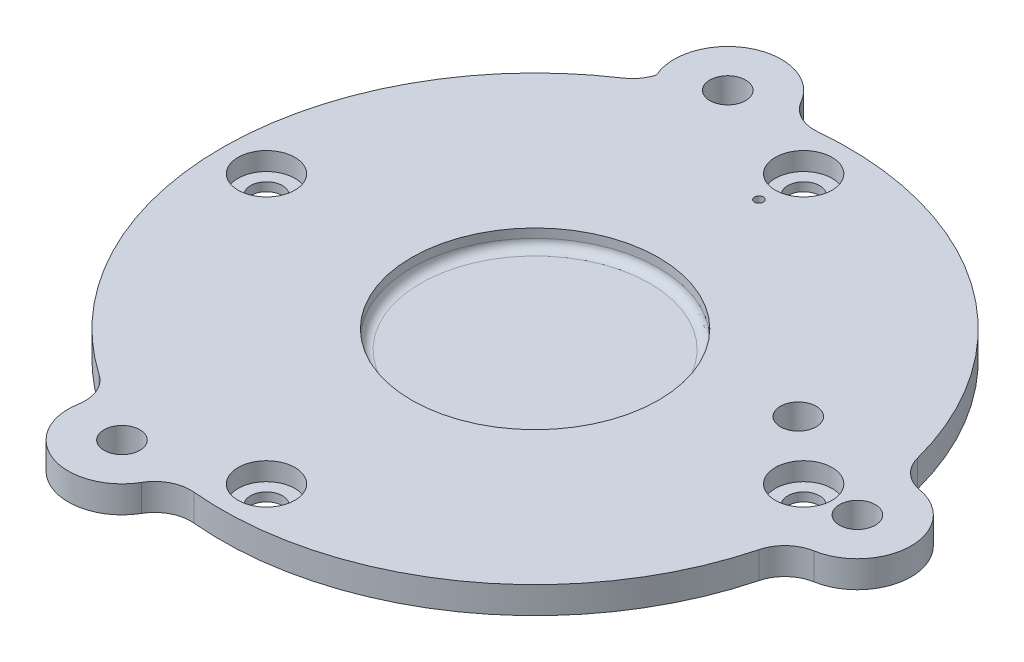
ISO-10303-21;
HEADER;
FILE_DESCRIPTION(('STEP AP214'),'2;1');
FILE_NAME('part.step','',(''),(''),'','','');
FILE_SCHEMA(('AUTOMOTIVE_DESIGN { 1 0 10303 214 1 1 1 1 }'));
ENDSEC;
DATA;
#1=APPLICATION_CONTEXT('core data for automotive mechanical design processes');
#2=APPLICATION_PROTOCOL_DEFINITION('international standard','automotive_design',2000,#1);
#3=PRODUCT_CONTEXT('',#1,'mechanical');
#4=PRODUCT('Part','Part','',(#3));
#5=PRODUCT_RELATED_PRODUCT_CATEGORY('part','',(#4));
#6=PRODUCT_DEFINITION_FORMATION('','',#4);
#7=PRODUCT_DEFINITION_CONTEXT('part definition',#1,'design');
#8=PRODUCT_DEFINITION('design','',#6,#7);
#9=PRODUCT_DEFINITION_SHAPE('','',#8);
#10=(LENGTH_UNIT() NAMED_UNIT(*) SI_UNIT(.MILLI.,.METRE.));
#11=(NAMED_UNIT(*) PLANE_ANGLE_UNIT() SI_UNIT($,.RADIAN.));
#12=(NAMED_UNIT(*) SI_UNIT($,.STERADIAN.) SOLID_ANGLE_UNIT());
#13=UNCERTAINTY_MEASURE_WITH_UNIT(LENGTH_MEASURE(1.E-05),#10,'distance_accuracy_value','');
#14=(GEOMETRIC_REPRESENTATION_CONTEXT(3) GLOBAL_UNCERTAINTY_ASSIGNED_CONTEXT((#13)) GLOBAL_UNIT_ASSIGNED_CONTEXT((#10,
#11,#12)) REPRESENTATION_CONTEXT('',''));
#15=CARTESIAN_POINT('',(0.,0.,0.));
#16=DIRECTION('',(0.,0.,1.));
#17=DIRECTION('',(1.,0.,0.));
#18=AXIS2_PLACEMENT_3D('',#15,#16,#17);
#19=CARTESIAN_POINT('',(0.,1.5,0.));
#20=DIRECTION('',(0.,-1.,0.));
#21=DIRECTION('',(0.,0.,-1.));
#22=AXIS2_PLACEMENT_3D('',#19,#20,#21);
#23=CYLINDRICAL_SURFACE('',#22,17.5);
#24=CARTESIAN_POINT('',(0.,0.,0.));
#25=DIRECTION('',(0.,1.,0.));
#26=DIRECTION('',(0.,0.,1.));
#27=AXIS2_PLACEMENT_3D('',#24,#25,#26);
#28=CIRCLE('',#27,17.5);
#29=CARTESIAN_POINT('',(-9.69466748680568,0.,-14.5692629298902));
#30=VERTEX_POINT('',#29);
#31=CARTESIAN_POINT('',(-9.94392059443859,0.,14.4002931640818));
#32=VERTEX_POINT('',#31);
#33=EDGE_CURVE('E225',#30,#32,#28,.T.);
#34=ORIENTED_EDGE('',*,*,#33,.T.);
#35=DIRECTION('',(0.,-1.,0.));
#36=VECTOR('',#35,1.);
#37=CARTESIAN_POINT('',(-9.94392059443859,1.5,14.4002931640818));
#38=LINE('',#37,#36);
#39=CARTESIAN_POINT('',(-9.94392059443859,1.5,14.4002931640818));
#40=VERTEX_POINT('',#39);
#41=EDGE_CURVE('E242',#32,#40,#38,.F.);
#42=ORIENTED_EDGE('',*,*,#41,.T.);
#43=CARTESIAN_POINT('',(0.,1.5,0.));
#44=DIRECTION('',(0.,1.,0.));
#45=DIRECTION('',(0.,0.,1.));
#46=AXIS2_PLACEMENT_3D('',#43,#44,#45);
#47=CIRCLE('',#46,17.5);
#48=CARTESIAN_POINT('',(-9.69466748680568,1.5,-14.5692629298902));
#49=VERTEX_POINT('',#48);
#50=EDGE_CURVE('E226',#49,#40,#47,.T.);
#51=ORIENTED_EDGE('',*,*,#50,.F.);
#52=DIRECTION('',(0.,-1.,0.));
#53=VECTOR('',#52,1.);
#54=CARTESIAN_POINT('',(-9.69466748680568,1.5,-14.5692629298902));
#55=LINE('',#54,#53);
#56=EDGE_CURVE('E240',#49,#30,#55,.T.);
#57=ORIENTED_EDGE('',*,*,#56,.T.);
#58=EDGE_LOOP('',(#34,#42,#51,#57));
#59=FACE_BOUND('',#58,.T.);
#60=ADVANCED_FACE('F37',(#59),#23,.T.);
#61=CARTESIAN_POINT('',(16.9328703703704,0.,-4.419038472364));
#62=VERTEX_POINT('',#61);
#63=CARTESIAN_POINT('',(-1.63884490753952,0.,-17.423093507441));
#64=VERTEX_POINT('',#63);
#65=EDGE_CURVE('E221',#62,#64,#28,.T.);
#66=ORIENTED_EDGE('',*,*,#65,.T.);
#67=DIRECTION('',(0.,-1.,0.));
#68=VECTOR('',#67,1.);
#69=CARTESIAN_POINT('',(-1.63884490753952,1.5,-17.423093507441));
#70=LINE('',#69,#68);
#71=CARTESIAN_POINT('',(-1.63884490753952,1.5,-17.423093507441));
#72=VERTEX_POINT('',#71);
#73=EDGE_CURVE('E252',#64,#72,#70,.F.);
#74=ORIENTED_EDGE('',*,*,#73,.T.);
#75=CARTESIAN_POINT('',(16.9328703703704,1.5,-4.419038472364));
#76=VERTEX_POINT('',#75);
#77=EDGE_CURVE('E222',#76,#72,#47,.T.);
#78=ORIENTED_EDGE('',*,*,#77,.F.);
#79=DIRECTION('',(0.,-1.,0.));
#80=VECTOR('',#79,1.);
#81=CARTESIAN_POINT('',(16.9328703703704,1.5,-4.419038472364));
#82=LINE('',#81,#80);
#83=EDGE_CURVE('E250',#76,#62,#82,.T.);
#84=ORIENTED_EDGE('',*,*,#83,.T.);
#85=EDGE_LOOP('',(#66,#74,#78,#84));
#86=FACE_BOUND('',#85,.T.);
#87=ADVANCED_FACE('F293',(#86),#23,.T.);
#88=CARTESIAN_POINT('',(-1.63884490753964,1.5,17.423093507441));
#89=VERTEX_POINT('',#88);
#90=CARTESIAN_POINT('',(16.9328703703704,1.5,4.419038472364));
#91=VERTEX_POINT('',#90);
#92=EDGE_CURVE('E224',#89,#91,#47,.T.);
#93=ORIENTED_EDGE('',*,*,#92,.F.);
#94=DIRECTION('',(0.,-1.,0.));
#95=VECTOR('',#94,1.);
#96=CARTESIAN_POINT('',(-1.63884490753964,1.5,17.423093507441));
#97=LINE('',#96,#95);
#98=CARTESIAN_POINT('',(-1.63884490753964,0.,17.423093507441));
#99=VERTEX_POINT('',#98);
#100=EDGE_CURVE('E233',#89,#99,#97,.T.);
#101=ORIENTED_EDGE('',*,*,#100,.T.);
#102=CARTESIAN_POINT('',(16.9328703703704,0.,4.419038472364));
#103=VERTEX_POINT('',#102);
#104=EDGE_CURVE('E229',#99,#103,#28,.T.);
#105=ORIENTED_EDGE('',*,*,#104,.T.);
#106=DIRECTION('',(0.,-1.,0.));
#107=VECTOR('',#106,1.);
#108=CARTESIAN_POINT('',(16.9328703703704,1.5,4.419038472364));
#109=LINE('',#108,#107);
#110=EDGE_CURVE('E230',#103,#91,#109,.F.);
#111=ORIENTED_EDGE('',*,*,#110,.T.);
#112=EDGE_LOOP('',(#93,#101,#105,#111));
#113=FACE_BOUND('',#112,.T.);
#114=ADVANCED_FACE('F296',(#113),#23,.T.);
#115=CARTESIAN_POINT('',(0.,1.5,0.));
#116=DIRECTION('',(0.,1.,0.));
#117=DIRECTION('',(0.,0.,1.));
#118=AXIS2_PLACEMENT_3D('',#115,#116,#117);
#119=PLANE('',#118);
#120=CARTESIAN_POINT('',(0.,1.5,0.));
#121=DIRECTION('',(0.,1.,0.));
#122=DIRECTION('',(0.,0.,1.));
#123=AXIS2_PLACEMENT_3D('',#120,#121,#122);
#124=CIRCLE('',#123,6.9);
#125=CARTESIAN_POINT('',(0.,1.5,6.9));
#126=VERTEX_POINT('',#125);
#127=EDGE_CURVE('E345',#126,#126,#124,.T.);
#128=ORIENTED_EDGE('',*,*,#127,.F.);
#129=EDGE_LOOP('',(#128));
#130=FACE_BOUND('',#129,.T.);
#131=CARTESIAN_POINT('',(-6.15636257986199,1.5,-16.9144671741464));
#132=DIRECTION('',(0.,1.,0.));
#133=DIRECTION('',(0.,0.,1.));
#134=AXIS2_PLACEMENT_3D('',#131,#132,#133);
#135=CIRCLE('',#134,0.999999999999999);
#136=CARTESIAN_POINT('',(-6.15636257986199,1.5,-15.9144671741464));
#137=VERTEX_POINT('',#136);
#138=EDGE_CURVE('E147',#137,#137,#135,.T.);
#139=ORIENTED_EDGE('',*,*,#138,.F.);
#140=EDGE_LOOP('',(#139));
#141=FACE_BOUND('',#140,.T.);
#142=CARTESIAN_POINT('',(18.,1.5,0.));
#143=DIRECTION('',(0.,1.,0.));
#144=DIRECTION('',(0.,0.,1.));
#145=AXIS2_PLACEMENT_3D('',#142,#143,#144);
#146=CIRCLE('',#145,1.);
#147=CARTESIAN_POINT('',(18.,1.5,1.));
#148=VERTEX_POINT('',#147);
#149=EDGE_CURVE('E352',#148,#148,#146,.T.);
#150=ORIENTED_EDGE('',*,*,#149,.F.);
#151=EDGE_LOOP('',(#150));
#152=FACE_BOUND('',#151,.T.);
#153=CARTESIAN_POINT('',(-6.15636257986211,1.5,16.9144671741463));
#154=DIRECTION('',(0.,1.,0.));
#155=DIRECTION('',(0.,0.,1.));
#156=AXIS2_PLACEMENT_3D('',#153,#154,#155);
#157=CIRCLE('',#156,0.999999999999999);
#158=CARTESIAN_POINT('',(-6.15636257986211,1.5,17.9144671741463));
#159=VERTEX_POINT('',#158);
#160=EDGE_CURVE('E335',#159,#159,#157,.T.);
#161=ORIENTED_EDGE('',*,*,#160,.F.);
#162=EDGE_LOOP('',(#161));
#163=FACE_BOUND('',#162,.T.);
#164=ORIENTED_EDGE('',*,*,#50,.T.);
#165=CARTESIAN_POINT('',(-11.0803686623744,1.5,16.0460409542625));
#166=DIRECTION('',(0.,1.,0.));
#167=DIRECTION('',(0.,0.,1.));
#168=AXIS2_PLACEMENT_3D('',#165,#166,#167);
#169=CIRCLE('',#168,2.);
#170=CARTESIAN_POINT('',(-9.1107662293695,1.5,16.3934114422161));
#171=VERTEX_POINT('',#170);
#172=EDGE_CURVE('E260',#40,#171,#169,.F.);
#173=ORIENTED_EDGE('',*,*,#172,.T.);
#174=CARTESIAN_POINT('',(-6.15636257986211,1.5,16.9144671741463));
#175=DIRECTION('',(0.,1.,0.));
#176=DIRECTION('',(0.,0.,1.));
#177=AXIS2_PLACEMENT_3D('',#174,#175,#176);
#178=CIRCLE('',#177,3.);
#179=CARTESIAN_POINT('',(-3.55822991298562,1.5,18.4143693860619));
#180=VERTEX_POINT('',#179);
#181=EDGE_CURVE('E341',#171,#180,#178,.T.);
#182=ORIENTED_EDGE('',*,*,#181,.T.);
#183=CARTESIAN_POINT('',(-1.82614146840131,1.5,19.4143041940056));
#184=DIRECTION('',(0.,1.,0.));
#185=DIRECTION('',(0.,0.,1.));
#186=AXIS2_PLACEMENT_3D('',#183,#184,#185);
#187=CIRCLE('',#186,2.);
#188=EDGE_CURVE('E258',#180,#89,#187,.F.);
#189=ORIENTED_EDGE('',*,*,#188,.T.);
#190=ORIENTED_EDGE('',*,*,#92,.T.);
#191=CARTESIAN_POINT('',(18.8680555555556,1.5,4.92407144063417));
#192=DIRECTION('',(0.,1.,0.));
#193=DIRECTION('',(0.,0.,1.));
#194=AXIS2_PLACEMENT_3D('',#191,#192,#193);
#195=CIRCLE('',#194,2.);
#196=CARTESIAN_POINT('',(18.5208333333333,1.5,2.9544428643805));
#197=VERTEX_POINT('',#196);
#198=EDGE_CURVE('E268',#91,#197,#195,.F.);
#199=ORIENTED_EDGE('',*,*,#198,.T.);
#200=CARTESIAN_POINT('',(18.,1.5,0.));
#201=DIRECTION('',(0.,1.,0.));
#202=DIRECTION('',(0.,0.,1.));
#203=AXIS2_PLACEMENT_3D('',#200,#201,#202);
#204=CIRCLE('',#203,3.);
#205=CARTESIAN_POINT('',(18.5208333333333,1.5,-2.9544428643805));
#206=VERTEX_POINT('',#205);
#207=EDGE_CURVE('E338',#197,#206,#204,.T.);
#208=ORIENTED_EDGE('',*,*,#207,.T.);
#209=CARTESIAN_POINT('',(18.8680555555556,1.5,-4.92407144063417));
#210=DIRECTION('',(0.,1.,0.));
#211=DIRECTION('',(0.,0.,1.));
#212=AXIS2_PLACEMENT_3D('',#209,#210,#211);
#213=CIRCLE('',#212,2.);
#214=EDGE_CURVE('E275',#206,#76,#213,.F.);
#215=ORIENTED_EDGE('',*,*,#214,.T.);
#216=ORIENTED_EDGE('',*,*,#77,.T.);
#217=CARTESIAN_POINT('',(-1.82614146840118,1.5,-19.4143041940057));
#218=DIRECTION('',(0.,1.,0.));
#219=DIRECTION('',(0.,0.,1.));
#220=AXIS2_PLACEMENT_3D('',#217,#218,#219);
#221=CIRCLE('',#220,2.);
#222=CARTESIAN_POINT('',(-3.5582299129855,1.5,-18.4143693860619));
#223=VERTEX_POINT('',#222);
#224=EDGE_CURVE('E52',#72,#223,#221,.F.);
#225=ORIENTED_EDGE('',*,*,#224,.T.);
#226=CARTESIAN_POINT('',(-6.15636257986199,1.5,-16.9144671741464));
#227=DIRECTION('',(0.,1.,0.));
#228=DIRECTION('',(0.,0.,1.));
#229=AXIS2_PLACEMENT_3D('',#226,#227,#228);
#230=CIRCLE('',#229,3.);
#231=CARTESIAN_POINT('',(-8.88012988846212,1.5,-15.6570525056296));
#232=VERTEX_POINT('',#231);
#233=EDGE_CURVE('E131',#223,#232,#230,.T.);
#234=ORIENTED_EDGE('',*,*,#233,.T.);
#235=CARTESIAN_POINT('',(0.,1.5,0.));
#236=DIRECTION('',(0.,1.,0.));
#237=DIRECTION('',(0.,0.,1.));
#238=AXIS2_PLACEMENT_3D('',#235,#236,#237);
#239=CIRCLE('',#238,18.);
#240=CARTESIAN_POINT('',(-8.88933322838314,1.5,-15.6518291185012));
#241=VERTEX_POINT('',#240);
#242=EDGE_CURVE('E137',#232,#241,#239,.T.);
#243=ORIENTED_EDGE('',*,*,#242,.T.);
#244=CARTESIAN_POINT('',(-10.8026294852978,1.5,-16.2343215504491));
#245=DIRECTION('',(0.,1.,0.));
#246=DIRECTION('',(0.,0.,1.));
#247=AXIS2_PLACEMENT_3D('',#244,#245,#246);
#248=CIRCLE('',#247,2.);
#249=EDGE_CURVE('E264',#241,#49,#248,.F.);
#250=ORIENTED_EDGE('',*,*,#249,.T.);
#251=EDGE_LOOP('',(#164,#173,#182,#189,#190,#199,#208,#215,#216,#225,#234,#243,#250));
#252=FACE_BOUND('',#251,.T.);
#253=CARTESIAN_POINT('',(0.,1.5,-15.));
#254=DIRECTION('',(0.,1.,0.));
#255=DIRECTION('',(0.,0.,1.));
#256=AXIS2_PLACEMENT_3D('',#253,#254,#255);
#257=CIRCLE('',#256,1.5875);
#258=CARTESIAN_POINT('',(0.,1.5,-13.4125));
#259=VERTEX_POINT('',#258);
#260=EDGE_CURVE('E160',#259,#259,#257,.T.);
#261=ORIENTED_EDGE('',*,*,#260,.F.);
#262=EDGE_LOOP('',(#261));
#263=FACE_BOUND('',#262,.T.);
#264=CARTESIAN_POINT('',(-15.,1.5,0.));
#265=DIRECTION('',(0.,1.,0.));
#266=DIRECTION('',(0.,0.,1.));
#267=AXIS2_PLACEMENT_3D('',#264,#265,#266);
#268=CIRCLE('',#267,1.5875);
#269=CARTESIAN_POINT('',(-15.,1.5,1.5875));
#270=VERTEX_POINT('',#269);
#271=EDGE_CURVE('E173',#270,#270,#268,.T.);
#272=ORIENTED_EDGE('',*,*,#271,.F.);
#273=EDGE_LOOP('',(#272));
#274=FACE_BOUND('',#273,.T.);
#275=CARTESIAN_POINT('',(0.,1.5,15.));
#276=DIRECTION('',(0.,1.,0.));
#277=DIRECTION('',(0.,0.,1.));
#278=AXIS2_PLACEMENT_3D('',#275,#276,#277);
#279=CIRCLE('',#278,1.5875);
#280=CARTESIAN_POINT('',(0.,1.5,16.5875));
#281=VERTEX_POINT('',#280);
#282=EDGE_CURVE('E185',#281,#281,#279,.T.);
#283=ORIENTED_EDGE('',*,*,#282,.F.);
#284=EDGE_LOOP('',(#283));
#285=FACE_BOUND('',#284,.T.);
#286=CARTESIAN_POINT('',(15.,1.5,0.));
#287=DIRECTION('',(0.,1.,0.));
#288=DIRECTION('',(0.,0.,1.));
#289=AXIS2_PLACEMENT_3D('',#286,#287,#288);
#290=CIRCLE('',#289,1.5875);
#291=CARTESIAN_POINT('',(15.,1.5,1.5875));
#292=VERTEX_POINT('',#291);
#293=EDGE_CURVE('E197',#292,#292,#290,.T.);
#294=ORIENTED_EDGE('',*,*,#293,.F.);
#295=EDGE_LOOP('',(#294));
#296=FACE_BOUND('',#295,.T.);
#297=CARTESIAN_POINT('',(0.,1.5,-12.5));
#298=DIRECTION('',(0.,1.,0.));
#299=DIRECTION('',(0.,0.,1.));
#300=AXIS2_PLACEMENT_3D('',#297,#298,#299);
#301=CIRCLE('',#300,0.25);
#302=CARTESIAN_POINT('',(0.,1.5,-12.25));
#303=VERTEX_POINT('',#302);
#304=EDGE_CURVE('E218',#303,#303,#301,.T.);
#305=ORIENTED_EDGE('',*,*,#304,.F.);
#306=EDGE_LOOP('',(#305));
#307=FACE_BOUND('',#306,.T.);
#308=CARTESIAN_POINT('',(11.5911099154688,1.5,-3.10582854123022));
#309=DIRECTION('',(0.,1.,0.));
#310=DIRECTION('',(0.,0.,1.));
#311=AXIS2_PLACEMENT_3D('',#308,#309,#310);
#312=CIRCLE('',#311,1.00000000000001);
#313=CARTESIAN_POINT('',(11.5911099154688,1.5,-2.10582854123021));
#314=VERTEX_POINT('',#313);
#315=EDGE_CURVE('E213',#314,#314,#312,.T.);
#316=ORIENTED_EDGE('',*,*,#315,.F.);
#317=EDGE_LOOP('',(#316));
#318=FACE_BOUND('',#317,.T.);
#319=ADVANCED_FACE('F134',(#130,#141,#152,#163,#252,#263,#274,#285,#296,#307,#318),#119,.T.);
#320=CARTESIAN_POINT('',(0.,0.,0.));
#321=DIRECTION('',(0.,1.,0.));
#322=DIRECTION('',(0.,0.,1.));
#323=AXIS2_PLACEMENT_3D('',#320,#321,#322);
#324=PLANE('',#323);
#325=CARTESIAN_POINT('',(-6.15636257986211,0.,16.9144671741463));
#326=DIRECTION('',(0.,1.,0.));
#327=DIRECTION('',(0.,0.,1.));
#328=AXIS2_PLACEMENT_3D('',#325,#326,#327);
#329=CIRCLE('',#328,0.999999999999999);
#330=CARTESIAN_POINT('',(-6.15636257986211,0.,17.9144671741463));
#331=VERTEX_POINT('',#330);
#332=EDGE_CURVE('E334',#331,#331,#329,.F.);
#333=ORIENTED_EDGE('',*,*,#332,.F.);
#334=EDGE_LOOP('',(#333));
#335=FACE_BOUND('',#334,.T.);
#336=ORIENTED_EDGE('',*,*,#104,.F.);
#337=CARTESIAN_POINT('',(-1.82614146840131,0.,19.4143041940056));
#338=DIRECTION('',(0.,1.,0.));
#339=DIRECTION('',(0.,0.,1.));
#340=AXIS2_PLACEMENT_3D('',#337,#338,#339);
#341=CIRCLE('',#340,2.);
#342=CARTESIAN_POINT('',(-3.55822991298562,0.,18.4143693860619));
#343=VERTEX_POINT('',#342);
#344=EDGE_CURVE('E256',#99,#343,#341,.T.);
#345=ORIENTED_EDGE('',*,*,#344,.T.);
#346=CARTESIAN_POINT('',(-6.15636257986211,0.,16.9144671741463));
#347=DIRECTION('',(0.,1.,0.));
#348=DIRECTION('',(0.,0.,1.));
#349=AXIS2_PLACEMENT_3D('',#346,#347,#348);
#350=CIRCLE('',#349,3.);
#351=CARTESIAN_POINT('',(-9.1107662293695,0.,16.3934114422161));
#352=VERTEX_POINT('',#351);
#353=EDGE_CURVE('E327',#343,#352,#350,.F.);
#354=ORIENTED_EDGE('',*,*,#353,.T.);
#355=CARTESIAN_POINT('',(-11.0803686623744,0.,16.0460409542625));
#356=DIRECTION('',(0.,1.,0.));
#357=DIRECTION('',(0.,0.,1.));
#358=AXIS2_PLACEMENT_3D('',#355,#356,#357);
#359=CIRCLE('',#358,2.);
#360=EDGE_CURVE('E262',#352,#32,#359,.T.);
#361=ORIENTED_EDGE('',*,*,#360,.T.);
#362=ORIENTED_EDGE('',*,*,#33,.F.);
#363=CARTESIAN_POINT('',(-10.8026294852978,0.,-16.2343215504491));
#364=DIRECTION('',(0.,1.,0.));
#365=DIRECTION('',(0.,0.,1.));
#366=AXIS2_PLACEMENT_3D('',#363,#364,#365);
#367=CIRCLE('',#366,2.);
#368=CARTESIAN_POINT('',(-8.88933322838315,0.,-15.6518291185012));
#369=VERTEX_POINT('',#368);
#370=EDGE_CURVE('E266',#30,#369,#367,.T.);
#371=ORIENTED_EDGE('',*,*,#370,.T.);
#372=CARTESIAN_POINT('',(0.,0.,0.));
#373=DIRECTION('',(0.,1.,0.));
#374=DIRECTION('',(0.,0.,1.));
#375=AXIS2_PLACEMENT_3D('',#372,#373,#374);
#376=CIRCLE('',#375,18.);
#377=CARTESIAN_POINT('',(-8.88012988846212,0.,-15.6570525056296));
#378=VERTEX_POINT('',#377);
#379=EDGE_CURVE('E157',#369,#378,#376,.F.);
#380=ORIENTED_EDGE('',*,*,#379,.T.);
#381=CARTESIAN_POINT('',(-6.15636257986199,0.,-16.9144671741464));
#382=DIRECTION('',(0.,1.,0.));
#383=DIRECTION('',(0.,0.,1.));
#384=AXIS2_PLACEMENT_3D('',#381,#382,#383);
#385=CIRCLE('',#384,3.);
#386=CARTESIAN_POINT('',(-3.5582299129855,0.,-18.4143693860619));
#387=VERTEX_POINT('',#386);
#388=EDGE_CURVE('E143',#378,#387,#385,.F.);
#389=ORIENTED_EDGE('',*,*,#388,.T.);
#390=CARTESIAN_POINT('',(-1.82614146840118,0.,-19.4143041940057));
#391=DIRECTION('',(0.,1.,0.));
#392=DIRECTION('',(0.,0.,1.));
#393=AXIS2_PLACEMENT_3D('',#390,#391,#392);
#394=CIRCLE('',#393,2.);
#395=EDGE_CURVE('E273',#387,#64,#394,.T.);
#396=ORIENTED_EDGE('',*,*,#395,.T.);
#397=ORIENTED_EDGE('',*,*,#65,.F.);
#398=CARTESIAN_POINT('',(18.8680555555556,0.,-4.92407144063417));
#399=DIRECTION('',(0.,1.,0.));
#400=DIRECTION('',(0.,0.,1.));
#401=AXIS2_PLACEMENT_3D('',#398,#399,#400);
#402=CIRCLE('',#401,2.);
#403=CARTESIAN_POINT('',(18.5208333333333,0.,-2.9544428643805));
#404=VERTEX_POINT('',#403);
#405=EDGE_CURVE('E277',#62,#404,#402,.T.);
#406=ORIENTED_EDGE('',*,*,#405,.T.);
#407=CARTESIAN_POINT('',(18.,0.,0.));
#408=DIRECTION('',(0.,1.,0.));
#409=DIRECTION('',(0.,0.,1.));
#410=AXIS2_PLACEMENT_3D('',#407,#408,#409);
#411=CIRCLE('',#410,3.);
#412=CARTESIAN_POINT('',(18.5208333333333,0.,2.9544428643805));
#413=VERTEX_POINT('',#412);
#414=EDGE_CURVE('E138',#404,#413,#411,.F.);
#415=ORIENTED_EDGE('',*,*,#414,.T.);
#416=CARTESIAN_POINT('',(18.8680555555556,0.,4.92407144063417));
#417=DIRECTION('',(0.,1.,0.));
#418=DIRECTION('',(0.,0.,1.));
#419=AXIS2_PLACEMENT_3D('',#416,#417,#418);
#420=CIRCLE('',#419,2.);
#421=EDGE_CURVE('E270',#413,#103,#420,.T.);
#422=ORIENTED_EDGE('',*,*,#421,.T.);
#423=EDGE_LOOP('',(#336,#345,#354,#361,#362,#371,#380,#389,#396,#397,#406,#415,#422));
#424=FACE_BOUND('',#423,.T.);
#425=CARTESIAN_POINT('',(-6.15636257986199,0.,-16.9144671741464));
#426=DIRECTION('',(0.,1.,0.));
#427=DIRECTION('',(0.,0.,1.));
#428=AXIS2_PLACEMENT_3D('',#425,#426,#427);
#429=CIRCLE('',#428,0.999999999999999);
#430=CARTESIAN_POINT('',(-6.15636257986199,0.,-15.9144671741464));
#431=VERTEX_POINT('',#430);
#432=EDGE_CURVE('E161',#431,#431,#429,.F.);
#433=ORIENTED_EDGE('',*,*,#432,.F.);
#434=EDGE_LOOP('',(#433));
#435=FACE_BOUND('',#434,.T.);
#436=CARTESIAN_POINT('',(0.,0.,-15.));
#437=DIRECTION('',(0.,1.,0.));
#438=DIRECTION('',(0.,0.,1.));
#439=AXIS2_PLACEMENT_3D('',#436,#437,#438);
#440=CIRCLE('',#439,0.889);
#441=CARTESIAN_POINT('',(0.,0.,-14.111));
#442=VERTEX_POINT('',#441);
#443=EDGE_CURVE('E170',#442,#442,#440,.T.);
#444=ORIENTED_EDGE('',*,*,#443,.T.);
#445=EDGE_LOOP('',(#444));
#446=FACE_BOUND('',#445,.T.);
#447=CARTESIAN_POINT('',(-15.,0.,0.));
#448=DIRECTION('',(0.,1.,0.));
#449=DIRECTION('',(0.,0.,1.));
#450=AXIS2_PLACEMENT_3D('',#447,#448,#449);
#451=CIRCLE('',#450,0.888999999999999);
#452=CARTESIAN_POINT('',(-15.,0.,0.888999999999999));
#453=VERTEX_POINT('',#452);
#454=EDGE_CURVE('E182',#453,#453,#451,.T.);
#455=ORIENTED_EDGE('',*,*,#454,.T.);
#456=EDGE_LOOP('',(#455));
#457=FACE_BOUND('',#456,.T.);
#458=CARTESIAN_POINT('',(0.,0.,15.));
#459=DIRECTION('',(0.,1.,0.));
#460=DIRECTION('',(0.,0.,1.));
#461=AXIS2_PLACEMENT_3D('',#458,#459,#460);
#462=CIRCLE('',#461,0.889);
#463=CARTESIAN_POINT('',(0.,0.,15.889));
#464=VERTEX_POINT('',#463);
#465=EDGE_CURVE('E194',#464,#464,#462,.T.);
#466=ORIENTED_EDGE('',*,*,#465,.T.);
#467=EDGE_LOOP('',(#466));
#468=FACE_BOUND('',#467,.T.);
#469=CARTESIAN_POINT('',(15.,0.,0.));
#470=DIRECTION('',(0.,1.,0.));
#471=DIRECTION('',(0.,0.,1.));
#472=AXIS2_PLACEMENT_3D('',#469,#470,#471);
#473=CIRCLE('',#472,0.889000000000001);
#474=CARTESIAN_POINT('',(15.,0.,0.889000000000001));
#475=VERTEX_POINT('',#474);
#476=EDGE_CURVE('E206',#475,#475,#473,.T.);
#477=ORIENTED_EDGE('',*,*,#476,.T.);
#478=EDGE_LOOP('',(#477));
#479=FACE_BOUND('',#478,.T.);
#480=CARTESIAN_POINT('',(0.,0.,-12.5));
#481=DIRECTION('',(0.,1.,0.));
#482=DIRECTION('',(0.,0.,1.));
#483=AXIS2_PLACEMENT_3D('',#480,#481,#482);
#484=CIRCLE('',#483,0.25);
#485=CARTESIAN_POINT('',(0.,0.,-12.25));
#486=VERTEX_POINT('',#485);
#487=EDGE_CURVE('E210',#486,#486,#484,.T.);
#488=ORIENTED_EDGE('',*,*,#487,.T.);
#489=EDGE_LOOP('',(#488));
#490=FACE_BOUND('',#489,.T.);
#491=CARTESIAN_POINT('',(11.5911099154688,0.,-3.10582854123022));
#492=DIRECTION('',(0.,1.,0.));
#493=DIRECTION('',(0.,0.,1.));
#494=AXIS2_PLACEMENT_3D('',#491,#492,#493);
#495=CIRCLE('',#494,1.00000000000001);
#496=CARTESIAN_POINT('',(11.5911099154688,0.,-2.10582854123021));
#497=VERTEX_POINT('',#496);
#498=EDGE_CURVE('E209',#497,#497,#495,.T.);
#499=ORIENTED_EDGE('',*,*,#498,.T.);
#500=EDGE_LOOP('',(#499));
#501=FACE_BOUND('',#500,.T.);
#502=CARTESIAN_POINT('',(18.,0.,0.));
#503=DIRECTION('',(0.,1.,0.));
#504=DIRECTION('',(0.,0.,1.));
#505=AXIS2_PLACEMENT_3D('',#502,#503,#504);
#506=CIRCLE('',#505,1.);
#507=CARTESIAN_POINT('',(18.,0.,1.));
#508=VERTEX_POINT('',#507);
#509=EDGE_CURVE('E349',#508,#508,#506,.F.);
#510=ORIENTED_EDGE('',*,*,#509,.F.);
#511=EDGE_LOOP('',(#510));
#512=FACE_BOUND('',#511,.T.);
#513=ADVANCED_FACE('F310',(#335,#424,#435,#446,#457,#468,#479,#490,#501,#512),#324,.F.);
#514=CARTESIAN_POINT('',(11.5911099154688,0.,-3.10582854123022));
#515=DIRECTION('',(0.,1.,0.));
#516=DIRECTION('',(0.,0.,1.));
#517=AXIS2_PLACEMENT_3D('',#514,#515,#516);
#518=CYLINDRICAL_SURFACE('',#517,1.00000000000001);
#519=ORIENTED_EDGE('',*,*,#315,.T.);
#520=EDGE_LOOP('',(#519));
#521=FACE_BOUND('',#520,.T.);
#522=ORIENTED_EDGE('',*,*,#498,.F.);
#523=EDGE_LOOP('',(#522));
#524=FACE_BOUND('',#523,.T.);
#525=ADVANCED_FACE('F363',(#521,#524),#518,.F.);
#526=CARTESIAN_POINT('',(0.,0.,-12.5));
#527=DIRECTION('',(0.,1.,0.));
#528=DIRECTION('',(0.,0.,1.));
#529=AXIS2_PLACEMENT_3D('',#526,#527,#528);
#530=CYLINDRICAL_SURFACE('',#529,0.25);
#531=ORIENTED_EDGE('',*,*,#304,.T.);
#532=EDGE_LOOP('',(#531));
#533=FACE_BOUND('',#532,.T.);
#534=ORIENTED_EDGE('',*,*,#487,.F.);
#535=EDGE_LOOP('',(#534));
#536=FACE_BOUND('',#535,.T.);
#537=ADVANCED_FACE('F448',(#533,#536),#530,.F.);
#538=CARTESIAN_POINT('',(15.,1.5,0.));
#539=DIRECTION('',(0.,1.,0.));
#540=DIRECTION('',(0.,0.,1.));
#541=AXIS2_PLACEMENT_3D('',#538,#539,#540);
#542=CYLINDRICAL_SURFACE('',#541,0.889000000000001);
#543=ORIENTED_EDGE('',*,*,#476,.F.);
#544=EDGE_LOOP('',(#543));
#545=FACE_BOUND('',#544,.T.);
#546=CARTESIAN_POINT('',(15.,0.484,0.));
#547=DIRECTION('',(0.,1.,0.));
#548=DIRECTION('',(0.,0.,1.));
#549=AXIS2_PLACEMENT_3D('',#546,#547,#548);
#550=CIRCLE('',#549,0.889000000000001);
#551=CARTESIAN_POINT('',(15.,0.484,0.889000000000001));
#552=VERTEX_POINT('',#551);
#553=EDGE_CURVE('E203',#552,#552,#550,.T.);
#554=ORIENTED_EDGE('',*,*,#553,.T.);
#555=EDGE_LOOP('',(#554));
#556=FACE_BOUND('',#555,.T.);
#557=ADVANCED_FACE('F444',(#545,#556),#542,.F.);
#558=CARTESIAN_POINT('',(15.889,0.484,0.));
#559=DIRECTION('',(0.,-1.,0.));
#560=DIRECTION('',(0.,0.,-1.));
#561=AXIS2_PLACEMENT_3D('',#558,#559,#560);
#562=PLANE('',#561);
#563=ORIENTED_EDGE('',*,*,#553,.F.);
#564=EDGE_LOOP('',(#563));
#565=FACE_BOUND('',#564,.T.);
#566=CARTESIAN_POINT('',(15.,0.484,0.));
#567=DIRECTION('',(0.,1.,0.));
#568=DIRECTION('',(0.,0.,1.));
#569=AXIS2_PLACEMENT_3D('',#566,#567,#568);
#570=CIRCLE('',#569,1.5875);
#571=CARTESIAN_POINT('',(15.,0.484,1.5875));
#572=VERTEX_POINT('',#571);
#573=EDGE_CURVE('E200',#572,#572,#570,.T.);
#574=ORIENTED_EDGE('',*,*,#573,.T.);
#575=EDGE_LOOP('',(#574));
#576=FACE_BOUND('',#575,.T.);
#577=ADVANCED_FACE('F440',(#565,#576),#562,.F.);
#578=CARTESIAN_POINT('',(15.,1.5,0.));
#579=DIRECTION('',(0.,1.,0.));
#580=DIRECTION('',(0.,0.,1.));
#581=AXIS2_PLACEMENT_3D('',#578,#579,#580);
#582=CYLINDRICAL_SURFACE('',#581,1.5875);
#583=ORIENTED_EDGE('',*,*,#573,.F.);
#584=EDGE_LOOP('',(#583));
#585=FACE_BOUND('',#584,.T.);
#586=ORIENTED_EDGE('',*,*,#293,.T.);
#587=EDGE_LOOP('',(#586));
#588=FACE_BOUND('',#587,.T.);
#589=ADVANCED_FACE('F436',(#585,#588),#582,.F.);
#590=CARTESIAN_POINT('',(0.,1.5,15.));
#591=DIRECTION('',(0.,1.,0.));
#592=DIRECTION('',(0.,0.,1.));
#593=AXIS2_PLACEMENT_3D('',#590,#591,#592);
#594=CYLINDRICAL_SURFACE('',#593,0.889);
#595=ORIENTED_EDGE('',*,*,#465,.F.);
#596=EDGE_LOOP('',(#595));
#597=FACE_BOUND('',#596,.T.);
#598=CARTESIAN_POINT('',(0.,0.484,15.));
#599=DIRECTION('',(0.,1.,0.));
#600=DIRECTION('',(0.,0.,1.));
#601=AXIS2_PLACEMENT_3D('',#598,#599,#600);
#602=CIRCLE('',#601,0.889);
#603=CARTESIAN_POINT('',(0.,0.484,15.889));
#604=VERTEX_POINT('',#603);
#605=EDGE_CURVE('E191',#604,#604,#602,.T.);
#606=ORIENTED_EDGE('',*,*,#605,.T.);
#607=EDGE_LOOP('',(#606));
#608=FACE_BOUND('',#607,.T.);
#609=ADVANCED_FACE('F432',(#597,#608),#594,.F.);
#610=CARTESIAN_POINT('',(0.889,0.484,15.));
#611=DIRECTION('',(0.,-1.,0.));
#612=DIRECTION('',(0.,0.,-1.));
#613=AXIS2_PLACEMENT_3D('',#610,#611,#612);
#614=PLANE('',#613);
#615=ORIENTED_EDGE('',*,*,#605,.F.);
#616=EDGE_LOOP('',(#615));
#617=FACE_BOUND('',#616,.T.);
#618=CARTESIAN_POINT('',(0.,0.484,15.));
#619=DIRECTION('',(0.,1.,0.));
#620=DIRECTION('',(0.,0.,1.));
#621=AXIS2_PLACEMENT_3D('',#618,#619,#620);
#622=CIRCLE('',#621,1.5875);
#623=CARTESIAN_POINT('',(0.,0.484,16.5875));
#624=VERTEX_POINT('',#623);
#625=EDGE_CURVE('E188',#624,#624,#622,.T.);
#626=ORIENTED_EDGE('',*,*,#625,.T.);
#627=EDGE_LOOP('',(#626));
#628=FACE_BOUND('',#627,.T.);
#629=ADVANCED_FACE('F428',(#617,#628),#614,.F.);
#630=CARTESIAN_POINT('',(0.,1.5,15.));
#631=DIRECTION('',(0.,1.,0.));
#632=DIRECTION('',(0.,0.,1.));
#633=AXIS2_PLACEMENT_3D('',#630,#631,#632);
#634=CYLINDRICAL_SURFACE('',#633,1.5875);
#635=ORIENTED_EDGE('',*,*,#625,.F.);
#636=EDGE_LOOP('',(#635));
#637=FACE_BOUND('',#636,.T.);
#638=ORIENTED_EDGE('',*,*,#282,.T.);
#639=EDGE_LOOP('',(#638));
#640=FACE_BOUND('',#639,.T.);
#641=ADVANCED_FACE('F424',(#637,#640),#634,.F.);
#642=CARTESIAN_POINT('',(-15.,1.5,0.));
#643=DIRECTION('',(0.,1.,0.));
#644=DIRECTION('',(0.,0.,1.));
#645=AXIS2_PLACEMENT_3D('',#642,#643,#644);
#646=CYLINDRICAL_SURFACE('',#645,0.888999999999999);
#647=ORIENTED_EDGE('',*,*,#454,.F.);
#648=EDGE_LOOP('',(#647));
#649=FACE_BOUND('',#648,.T.);
#650=CARTESIAN_POINT('',(-15.,0.484,0.));
#651=DIRECTION('',(0.,1.,0.));
#652=DIRECTION('',(0.,0.,1.));
#653=AXIS2_PLACEMENT_3D('',#650,#651,#652);
#654=CIRCLE('',#653,0.888999999999999);
#655=CARTESIAN_POINT('',(-15.,0.484,0.888999999999999));
#656=VERTEX_POINT('',#655);
#657=EDGE_CURVE('E179',#656,#656,#654,.T.);
#658=ORIENTED_EDGE('',*,*,#657,.T.);
#659=EDGE_LOOP('',(#658));
#660=FACE_BOUND('',#659,.T.);
#661=ADVANCED_FACE('F420',(#649,#660),#646,.F.);
#662=CARTESIAN_POINT('',(-14.111,0.484,0.));
#663=DIRECTION('',(0.,-1.,0.));
#664=DIRECTION('',(0.,0.,-1.));
#665=AXIS2_PLACEMENT_3D('',#662,#663,#664);
#666=PLANE('',#665);
#667=ORIENTED_EDGE('',*,*,#657,.F.);
#668=EDGE_LOOP('',(#667));
#669=FACE_BOUND('',#668,.T.);
#670=CARTESIAN_POINT('',(-15.,0.484,0.));
#671=DIRECTION('',(0.,1.,0.));
#672=DIRECTION('',(0.,0.,1.));
#673=AXIS2_PLACEMENT_3D('',#670,#671,#672);
#674=CIRCLE('',#673,1.5875);
#675=CARTESIAN_POINT('',(-15.,0.484,1.5875));
#676=VERTEX_POINT('',#675);
#677=EDGE_CURVE('E176',#676,#676,#674,.T.);
#678=ORIENTED_EDGE('',*,*,#677,.T.);
#679=EDGE_LOOP('',(#678));
#680=FACE_BOUND('',#679,.T.);
#681=ADVANCED_FACE('F416',(#669,#680),#666,.F.);
#682=CARTESIAN_POINT('',(-15.,1.5,0.));
#683=DIRECTION('',(0.,1.,0.));
#684=DIRECTION('',(0.,0.,1.));
#685=AXIS2_PLACEMENT_3D('',#682,#683,#684);
#686=CYLINDRICAL_SURFACE('',#685,1.5875);
#687=ORIENTED_EDGE('',*,*,#677,.F.);
#688=EDGE_LOOP('',(#687));
#689=FACE_BOUND('',#688,.T.);
#690=ORIENTED_EDGE('',*,*,#271,.T.);
#691=EDGE_LOOP('',(#690));
#692=FACE_BOUND('',#691,.T.);
#693=ADVANCED_FACE('F412',(#689,#692),#686,.F.);
#694=CARTESIAN_POINT('',(0.,1.5,-15.));
#695=DIRECTION('',(0.,1.,0.));
#696=DIRECTION('',(0.,0.,1.));
#697=AXIS2_PLACEMENT_3D('',#694,#695,#696);
#698=CYLINDRICAL_SURFACE('',#697,0.889);
#699=ORIENTED_EDGE('',*,*,#443,.F.);
#700=EDGE_LOOP('',(#699));
#701=FACE_BOUND('',#700,.T.);
#702=CARTESIAN_POINT('',(0.,0.484,-15.));
#703=DIRECTION('',(0.,1.,0.));
#704=DIRECTION('',(0.,0.,1.));
#705=AXIS2_PLACEMENT_3D('',#702,#703,#704);
#706=CIRCLE('',#705,0.889);
#707=CARTESIAN_POINT('',(0.,0.484,-14.111));
#708=VERTEX_POINT('',#707);
#709=EDGE_CURVE('E167',#708,#708,#706,.T.);
#710=ORIENTED_EDGE('',*,*,#709,.T.);
#711=EDGE_LOOP('',(#710));
#712=FACE_BOUND('',#711,.T.);
#713=ADVANCED_FACE('F408',(#701,#712),#698,.F.);
#714=CARTESIAN_POINT('',(0.889,0.484,-15.));
#715=DIRECTION('',(0.,-1.,0.));
#716=DIRECTION('',(0.,0.,-1.));
#717=AXIS2_PLACEMENT_3D('',#714,#715,#716);
#718=PLANE('',#717);
#719=ORIENTED_EDGE('',*,*,#709,.F.);
#720=EDGE_LOOP('',(#719));
#721=FACE_BOUND('',#720,.T.);
#722=CARTESIAN_POINT('',(0.,0.484,-15.));
#723=DIRECTION('',(0.,1.,0.));
#724=DIRECTION('',(0.,0.,1.));
#725=AXIS2_PLACEMENT_3D('',#722,#723,#724);
#726=CIRCLE('',#725,1.5875);
#727=CARTESIAN_POINT('',(0.,0.484,-13.4125));
#728=VERTEX_POINT('',#727);
#729=EDGE_CURVE('E164',#728,#728,#726,.T.);
#730=ORIENTED_EDGE('',*,*,#729,.T.);
#731=EDGE_LOOP('',(#730));
#732=FACE_BOUND('',#731,.T.);
#733=ADVANCED_FACE('F404',(#721,#732),#718,.F.);
#734=CARTESIAN_POINT('',(0.,1.5,-15.));
#735=DIRECTION('',(0.,1.,0.));
#736=DIRECTION('',(0.,0.,1.));
#737=AXIS2_PLACEMENT_3D('',#734,#735,#736);
#738=CYLINDRICAL_SURFACE('',#737,1.5875);
#739=ORIENTED_EDGE('',*,*,#729,.F.);
#740=EDGE_LOOP('',(#739));
#741=FACE_BOUND('',#740,.T.);
#742=ORIENTED_EDGE('',*,*,#260,.T.);
#743=EDGE_LOOP('',(#742));
#744=FACE_BOUND('',#743,.T.);
#745=ADVANCED_FACE('F396',(#741,#744),#738,.F.);
#746=CARTESIAN_POINT('',(-6.15636257986199,-8.48528137423857,-16.9144671741464));
#747=DIRECTION('',(0.,1.,0.));
#748=DIRECTION('',(0.,0.,1.));
#749=AXIS2_PLACEMENT_3D('',#746,#747,#748);
#750=CYLINDRICAL_SURFACE('',#749,0.999999999999999);
#751=ORIENTED_EDGE('',*,*,#138,.T.);
#752=EDGE_LOOP('',(#751));
#753=FACE_BOUND('',#752,.T.);
#754=ORIENTED_EDGE('',*,*,#432,.T.);
#755=EDGE_LOOP('',(#754));
#756=FACE_BOUND('',#755,.T.);
#757=ADVANCED_FACE('F360',(#753,#756),#750,.F.);
#758=CARTESIAN_POINT('',(0.,-8.48528137423857,0.));
#759=DIRECTION('',(0.,1.,0.));
#760=DIRECTION('',(0.,0.,1.));
#761=AXIS2_PLACEMENT_3D('',#758,#759,#760);
#762=CYLINDRICAL_SURFACE('',#761,18.);
#763=ORIENTED_EDGE('',*,*,#379,.F.);
#764=DIRECTION('',(0.,1.,0.));
#765=VECTOR('',#764,1.);
#766=CARTESIAN_POINT('',(-8.88933322838314,-8.48528137423857,-15.6518291185012));
#767=LINE('',#766,#765);
#768=EDGE_CURVE('E146',#369,#241,#767,.T.);
#769=ORIENTED_EDGE('',*,*,#768,.T.);
#770=ORIENTED_EDGE('',*,*,#242,.F.);
#771=DIRECTION('',(0.,1.,0.));
#772=VECTOR('',#771,1.);
#773=CARTESIAN_POINT('',(-8.88012988846212,-8.48528137423857,-15.6570525056296));
#774=LINE('',#773,#772);
#775=EDGE_CURVE('E141',#378,#232,#774,.T.);
#776=ORIENTED_EDGE('',*,*,#775,.F.);
#777=EDGE_LOOP('',(#763,#769,#770,#776));
#778=FACE_BOUND('',#777,.T.);
#779=ADVANCED_FACE('F150',(#778),#762,.T.);
#780=CARTESIAN_POINT('',(-6.15636257986199,-8.48528137423857,-16.9144671741464));
#781=DIRECTION('',(0.,1.,0.));
#782=DIRECTION('',(0.,0.,1.));
#783=AXIS2_PLACEMENT_3D('',#780,#781,#782);
#784=CYLINDRICAL_SURFACE('',#783,3.);
#785=ORIENTED_EDGE('',*,*,#233,.F.);
#786=DIRECTION('',(0.,1.,0.));
#787=VECTOR('',#786,1.);
#788=CARTESIAN_POINT('',(-3.5582299129855,-8.48528137423857,-18.4143693860619));
#789=LINE('',#788,#787);
#790=EDGE_CURVE('E59',#223,#387,#789,.F.);
#791=ORIENTED_EDGE('',*,*,#790,.T.);
#792=ORIENTED_EDGE('',*,*,#388,.F.);
#793=ORIENTED_EDGE('',*,*,#775,.T.);
#794=EDGE_LOOP('',(#785,#791,#792,#793));
#795=FACE_BOUND('',#794,.T.);
#796=ADVANCED_FACE('F142',(#795),#784,.T.);
#797=CARTESIAN_POINT('',(18.,-8.48528137423857,0.));
#798=DIRECTION('',(0.,1.,0.));
#799=DIRECTION('',(0.,0.,1.));
#800=AXIS2_PLACEMENT_3D('',#797,#798,#799);
#801=CYLINDRICAL_SURFACE('',#800,3.);
#802=ORIENTED_EDGE('',*,*,#207,.F.);
#803=DIRECTION('',(0.,1.,0.));
#804=VECTOR('',#803,1.);
#805=CARTESIAN_POINT('',(18.5208333333333,-8.48528137423857,2.9544428643805));
#806=LINE('',#805,#804);
#807=EDGE_CURVE('E248',#197,#413,#806,.F.);
#808=ORIENTED_EDGE('',*,*,#807,.T.);
#809=ORIENTED_EDGE('',*,*,#414,.F.);
#810=DIRECTION('',(0.,1.,0.));
#811=VECTOR('',#810,1.);
#812=CARTESIAN_POINT('',(18.5208333333333,-8.48528137423857,-2.9544428643805));
#813=LINE('',#812,#811);
#814=EDGE_CURVE('E245',#404,#206,#813,.T.);
#815=ORIENTED_EDGE('',*,*,#814,.T.);
#816=EDGE_LOOP('',(#802,#808,#809,#815));
#817=FACE_BOUND('',#816,.T.);
#818=ADVANCED_FACE('F381',(#817),#801,.T.);
#819=CARTESIAN_POINT('',(18.,-8.48528137423857,0.));
#820=DIRECTION('',(0.,1.,0.));
#821=DIRECTION('',(0.,0.,1.));
#822=AXIS2_PLACEMENT_3D('',#819,#820,#821);
#823=CYLINDRICAL_SURFACE('',#822,1.);
#824=ORIENTED_EDGE('',*,*,#149,.T.);
#825=EDGE_LOOP('',(#824));
#826=FACE_BOUND('',#825,.T.);
#827=ORIENTED_EDGE('',*,*,#509,.T.);
#828=EDGE_LOOP('',(#827));
#829=FACE_BOUND('',#828,.T.);
#830=ADVANCED_FACE('F379',(#826,#829),#823,.F.);
#831=CARTESIAN_POINT('',(-6.15636257986211,-8.48528137423857,16.9144671741463));
#832=DIRECTION('',(0.,1.,0.));
#833=DIRECTION('',(0.,0.,1.));
#834=AXIS2_PLACEMENT_3D('',#831,#832,#833);
#835=CYLINDRICAL_SURFACE('',#834,3.);
#836=ORIENTED_EDGE('',*,*,#353,.F.);
#837=DIRECTION('',(0.,1.,0.));
#838=VECTOR('',#837,1.);
#839=CARTESIAN_POINT('',(-3.55822991298562,-8.48528137423857,18.4143693860619));
#840=LINE('',#839,#838);
#841=EDGE_CURVE('E238',#343,#180,#840,.T.);
#842=ORIENTED_EDGE('',*,*,#841,.T.);
#843=ORIENTED_EDGE('',*,*,#181,.F.);
#844=DIRECTION('',(0.,1.,0.));
#845=VECTOR('',#844,1.);
#846=CARTESIAN_POINT('',(-9.1107662293695,-8.48528137423857,16.3934114422161));
#847=LINE('',#846,#845);
#848=EDGE_CURVE('E236',#171,#352,#847,.F.);
#849=ORIENTED_EDGE('',*,*,#848,.T.);
#850=EDGE_LOOP('',(#836,#842,#843,#849));
#851=FACE_BOUND('',#850,.T.);
#852=ADVANCED_FACE('F330',(#851),#835,.T.);
#853=CARTESIAN_POINT('',(-6.15636257986211,-8.48528137423857,16.9144671741463));
#854=DIRECTION('',(0.,1.,0.));
#855=DIRECTION('',(0.,0.,1.));
#856=AXIS2_PLACEMENT_3D('',#853,#854,#855);
#857=CYLINDRICAL_SURFACE('',#856,0.999999999999999);
#858=ORIENTED_EDGE('',*,*,#160,.T.);
#859=EDGE_LOOP('',(#858));
#860=FACE_BOUND('',#859,.T.);
#861=ORIENTED_EDGE('',*,*,#332,.T.);
#862=EDGE_LOOP('',(#861));
#863=FACE_BOUND('',#862,.T.);
#864=ADVANCED_FACE('F388',(#860,#863),#857,.F.);
#865=CARTESIAN_POINT('',(-1.82614146840131,-8.48528137423857,19.4143041940056));
#866=DIRECTION('',(0.,1.,0.));
#867=DIRECTION('',(0.,0.,1.));
#868=AXIS2_PLACEMENT_3D('',#865,#866,#867);
#869=CYLINDRICAL_SURFACE('',#868,2.);
#870=ORIENTED_EDGE('',*,*,#188,.F.);
#871=ORIENTED_EDGE('',*,*,#841,.F.);
#872=ORIENTED_EDGE('',*,*,#344,.F.);
#873=ORIENTED_EDGE('',*,*,#100,.F.);
#874=EDGE_LOOP('',(#870,#871,#872,#873));
#875=FACE_BOUND('',#874,.T.);
#876=ADVANCED_FACE('F321',(#875),#869,.F.);
#877=CARTESIAN_POINT('',(-11.0803686623744,-8.48528137423857,16.0460409542625));
#878=DIRECTION('',(0.,-1.,0.));
#879=DIRECTION('',(0.,0.,-1.));
#880=AXIS2_PLACEMENT_3D('',#877,#878,#879);
#881=CYLINDRICAL_SURFACE('',#880,2.);
#882=ORIENTED_EDGE('',*,*,#360,.F.);
#883=ORIENTED_EDGE('',*,*,#848,.F.);
#884=ORIENTED_EDGE('',*,*,#172,.F.);
#885=ORIENTED_EDGE('',*,*,#41,.F.);
#886=EDGE_LOOP('',(#882,#883,#884,#885));
#887=FACE_BOUND('',#886,.T.);
#888=ADVANCED_FACE('F548',(#887),#881,.F.);
#889=CARTESIAN_POINT('',(-10.8026294852978,1.5,-16.2343215504491));
#890=DIRECTION('',(0.,-1.,0.));
#891=DIRECTION('',(0.,0.,-1.));
#892=AXIS2_PLACEMENT_3D('',#889,#890,#891);
#893=CYLINDRICAL_SURFACE('',#892,2.);
#894=ORIENTED_EDGE('',*,*,#370,.F.);
#895=ORIENTED_EDGE('',*,*,#56,.F.);
#896=ORIENTED_EDGE('',*,*,#249,.F.);
#897=ORIENTED_EDGE('',*,*,#768,.F.);
#898=EDGE_LOOP('',(#894,#895,#896,#897));
#899=FACE_BOUND('',#898,.T.);
#900=ADVANCED_FACE('F556',(#899),#893,.F.);
#901=CARTESIAN_POINT('',(18.8680555555556,-8.48528137423857,4.92407144063417));
#902=DIRECTION('',(0.,-1.,0.));
#903=DIRECTION('',(0.,0.,-1.));
#904=AXIS2_PLACEMENT_3D('',#901,#902,#903);
#905=CYLINDRICAL_SURFACE('',#904,2.);
#906=ORIENTED_EDGE('',*,*,#421,.F.);
#907=ORIENTED_EDGE('',*,*,#807,.F.);
#908=ORIENTED_EDGE('',*,*,#198,.F.);
#909=ORIENTED_EDGE('',*,*,#110,.F.);
#910=EDGE_LOOP('',(#906,#907,#908,#909));
#911=FACE_BOUND('',#910,.T.);
#912=ADVANCED_FACE('F566',(#911),#905,.F.);
#913=CARTESIAN_POINT('',(-1.82614146840118,-8.48528137423857,-19.4143041940057));
#914=DIRECTION('',(0.,-1.,0.));
#915=DIRECTION('',(0.,0.,-1.));
#916=AXIS2_PLACEMENT_3D('',#913,#914,#915);
#917=CYLINDRICAL_SURFACE('',#916,2.);
#918=ORIENTED_EDGE('',*,*,#395,.F.);
#919=ORIENTED_EDGE('',*,*,#790,.F.);
#920=ORIENTED_EDGE('',*,*,#224,.F.);
#921=ORIENTED_EDGE('',*,*,#73,.F.);
#922=EDGE_LOOP('',(#918,#919,#920,#921));
#923=FACE_BOUND('',#922,.T.);
#924=ADVANCED_FACE('F576',(#923),#917,.F.);
#925=CARTESIAN_POINT('',(18.8680555555556,1.5,-4.92407144063417));
#926=DIRECTION('',(0.,-1.,0.));
#927=DIRECTION('',(0.,0.,-1.));
#928=AXIS2_PLACEMENT_3D('',#925,#926,#927);
#929=CYLINDRICAL_SURFACE('',#928,2.);
#930=ORIENTED_EDGE('',*,*,#405,.F.);
#931=ORIENTED_EDGE('',*,*,#83,.F.);
#932=ORIENTED_EDGE('',*,*,#214,.F.);
#933=ORIENTED_EDGE('',*,*,#814,.F.);
#934=EDGE_LOOP('',(#930,#931,#932,#933));
#935=FACE_BOUND('',#934,.T.);
#936=ADVANCED_FACE('F586',(#935),#929,.F.);
#937=CARTESIAN_POINT('',(0.,0.5,0.));
#938=DIRECTION('',(0.,1.,0.));
#939=DIRECTION('',(0.,0.,1.));
#940=AXIS2_PLACEMENT_3D('',#937,#938,#939);
#941=CYLINDRICAL_SURFACE('',#940,6.9);
#942=CARTESIAN_POINT('',(0.,1.,0.));
#943=DIRECTION('',(0.,1.,0.));
#944=DIRECTION('',(0.,0.,1.));
#945=AXIS2_PLACEMENT_3D('',#942,#943,#944);
#946=CIRCLE('',#945,6.9);
#947=CARTESIAN_POINT('',(0.,1.,6.9));
#948=VERTEX_POINT('',#947);
#949=EDGE_CURVE('E11',#948,#948,#946,.F.);
#950=ORIENTED_EDGE('',*,*,#949,.T.);
#951=EDGE_LOOP('',(#950));
#952=FACE_BOUND('',#951,.T.);
#953=ORIENTED_EDGE('',*,*,#127,.T.);
#954=EDGE_LOOP('',(#953));
#955=FACE_BOUND('',#954,.T.);
#956=ADVANCED_FACE('F289',(#952,#955),#941,.F.);
#957=CARTESIAN_POINT('',(0.,0.5,0.));
#958=DIRECTION('',(0.,1.,0.));
#959=DIRECTION('',(0.,0.,1.));
#960=AXIS2_PLACEMENT_3D('',#957,#958,#959);
#961=PLANE('',#960);
#962=CARTESIAN_POINT('',(0.,0.5,0.));
#963=DIRECTION('',(0.,1.,0.));
#964=DIRECTION('',(0.,0.,1.));
#965=AXIS2_PLACEMENT_3D('',#962,#963,#964);
#966=CIRCLE('',#965,6.4);
#967=CARTESIAN_POINT('',(0.,0.5,6.4));
#968=VERTEX_POINT('',#967);
#969=EDGE_CURVE('E45',#968,#968,#966,.T.);
#970=ORIENTED_EDGE('',*,*,#969,.T.);
#971=EDGE_LOOP('',(#970));
#972=FACE_BOUND('',#971,.T.);
#973=ADVANCED_FACE('F281',(#972),#961,.T.);
#974=CARTESIAN_POINT('',(0.,1.,0.));
#975=DIRECTION('',(0.,1.,0.));
#976=DIRECTION('',(0.,0.,1.));
#977=AXIS2_PLACEMENT_3D('',#974,#975,#976);
#978=TOROIDAL_SURFACE('',#977,6.4,0.5);
#979=ORIENTED_EDGE('',*,*,#949,.F.);
#980=EDGE_LOOP('',(#979));
#981=FACE_BOUND('',#980,.T.);
#982=ORIENTED_EDGE('',*,*,#969,.F.);
#983=EDGE_LOOP('',(#982));
#984=FACE_BOUND('',#983,.T.);
#985=ADVANCED_FACE('F39',(#981,#984),#978,.F.);
#986=CLOSED_SHELL('',(#60,#87,#114,#319,#513,#525,#537,#557,#577,#589,#609,#629,#641,#661,#681,
#693,#713,#733,#745,#757,#779,#796,#818,#830,#852,#864,#876,#888,#900,#912,#924,#936,#956,#973,#985));
#987=MANIFOLD_SOLID_BREP('B2',#986);
#988=ADVANCED_BREP_SHAPE_REPRESENTATION('',(#18,#987),#14);
#989=SHAPE_DEFINITION_REPRESENTATION(#9,#988);
ENDSEC;
END-ISO-10303-21;
